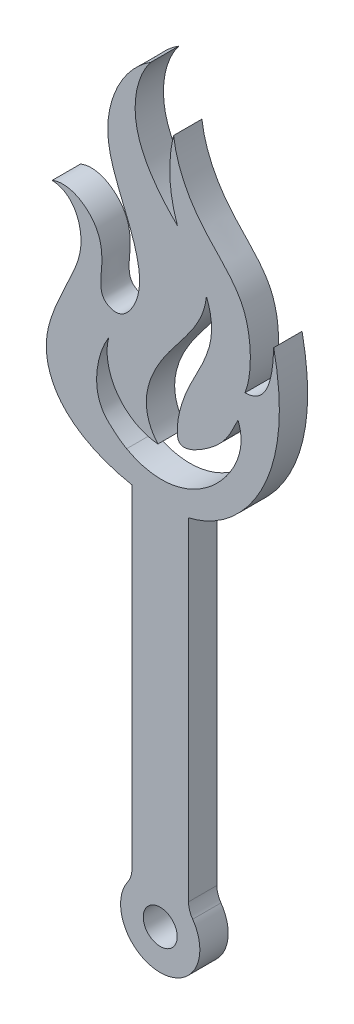
ISO-10303-21;
HEADER;
FILE_DESCRIPTION(('STEP AP214'),'2;1');
FILE_NAME('part.step','',(''),(''),'','','');
FILE_SCHEMA(('AUTOMOTIVE_DESIGN { 1 0 10303 214 1 1 1 1 }'));
ENDSEC;
DATA;
#1=APPLICATION_CONTEXT('core data for automotive mechanical design processes');
#2=APPLICATION_PROTOCOL_DEFINITION('international standard','automotive_design',2000,#1);
#3=PRODUCT_CONTEXT('',#1,'mechanical');
#4=PRODUCT('Part','Part','',(#3));
#5=PRODUCT_RELATED_PRODUCT_CATEGORY('part','',(#4));
#6=PRODUCT_DEFINITION_FORMATION('','',#4);
#7=PRODUCT_DEFINITION_CONTEXT('part definition',#1,'design');
#8=PRODUCT_DEFINITION('design','',#6,#7);
#9=PRODUCT_DEFINITION_SHAPE('','',#8);
#10=(LENGTH_UNIT() NAMED_UNIT(*) SI_UNIT(.MILLI.,.METRE.));
#11=(NAMED_UNIT(*) PLANE_ANGLE_UNIT() SI_UNIT($,.RADIAN.));
#12=(NAMED_UNIT(*) SI_UNIT($,.STERADIAN.) SOLID_ANGLE_UNIT());
#13=UNCERTAINTY_MEASURE_WITH_UNIT(LENGTH_MEASURE(1.E-05),#10,'distance_accuracy_value','');
#14=(GEOMETRIC_REPRESENTATION_CONTEXT(3) GLOBAL_UNCERTAINTY_ASSIGNED_CONTEXT((#13)) GLOBAL_UNIT_ASSIGNED_CONTEXT((#10,
#11,#12)) REPRESENTATION_CONTEXT('',''));
#15=CARTESIAN_POINT('',(0.,0.,0.));
#16=DIRECTION('',(0.,0.,1.));
#17=DIRECTION('',(1.,0.,0.));
#18=AXIS2_PLACEMENT_3D('',#15,#16,#17);
#19=CARTESIAN_POINT('',(-4.5,3.16227766016838,2.5));
#20=DIRECTION('',(0.,0.,-1.));
#21=DIRECTION('',(-1.,0.,0.));
#22=AXIS2_PLACEMENT_3D('',#19,#20,#21);
#23=PLANE('',#22);
#24=DIRECTION('',(0.,1.,0.));
#25=VECTOR('',#24,1.);
#26=CARTESIAN_POINT('',(2.5,3.16227766016838,2.5));
#27=LINE('',#26,#25);
#28=CARTESIAN_POINT('',(2.5,3.16227766016838,2.5));
#29=VERTEX_POINT('',#28);
#30=CARTESIAN_POINT('',(2.49999999029242,32.5197236566721,2.5));
#31=VERTEX_POINT('',#30);
#32=EDGE_CURVE('E404',#29,#31,#27,.T.);
#33=ORIENTED_EDGE('',*,*,#32,.T.);
#34=CARTESIAN_POINT('',(10.0215195762299,49.2926233796134,2.5));
#35=CARTESIAN_POINT('',(10.5629229150883,46.6911220435722,2.5));
#36=CARTESIAN_POINT('',(10.8473599430749,41.9965481647444,2.5));
#37=CARTESIAN_POINT('',(8.01912510882976,35.3828982693129,2.5));
#38=CARTESIAN_POINT('',(4.24658066054622,32.7190283289578,2.5));
#39=CARTESIAN_POINT('',(1.69954817010965,32.3698649960101,2.5));
#40=B_SPLINE_CURVE_WITH_KNOTS('',3,(#34,#35,#36,#37,#38,#39),.UNSPECIFIED.,.F.,.F.,(4,1,1,4),
(0.,0.383344552097258,0.656086203099955,1.),.UNSPECIFIED.);
#41=CARTESIAN_POINT('',(10.0215195762299,49.2926233796134,2.5));
#42=VERTEX_POINT('',#41);
#43=EDGE_CURVE('E237',#31,#42,#40,.F.);
#44=ORIENTED_EDGE('',*,*,#43,.T.);
#45=CARTESIAN_POINT('',(7.48535231010146,44.5693598019665,2.5));
#46=CARTESIAN_POINT('',(9.81467097454117,44.5706924915672,2.5));
#47=CARTESIAN_POINT('',(9.95438839272268,47.7175172464842,2.5));
#48=CARTESIAN_POINT('',(10.0215195762299,49.2926233796134,2.5));
#49=B_SPLINE_CURVE_WITH_KNOTS('',3,(#45,#46,#47,#48),.UNSPECIFIED.,.F.,.F.,(4,4),(0.,1.),.UNSPECIFIED.);
#50=CARTESIAN_POINT('',(7.48535231010146,44.5693598019665,2.5));
#51=VERTEX_POINT('',#50);
#52=EDGE_CURVE('E244',#42,#51,#49,.F.);
#53=ORIENTED_EDGE('',*,*,#52,.T.);
#54=CARTESIAN_POINT('',(1.17819794851139,61.0895272607658,2.5));
#55=CARTESIAN_POINT('',(1.45472809990184,58.9635735649893,2.5));
#56=CARTESIAN_POINT('',(3.22122630729269,55.3695109460361,2.5));
#57=CARTESIAN_POINT('',(7.32555201717921,52.1053239640368,2.5));
#58=CARTESIAN_POINT('',(8.09982119042889,47.9498492754425,2.5));
#59=CARTESIAN_POINT('',(7.90988611510032,45.7039675829994,2.5));
#60=CARTESIAN_POINT('',(7.48535231010146,44.5693598019665,2.5));
#61=B_SPLINE_CURVE_WITH_KNOTS('',3,(#54,#55,#56,#57,#58,#59,#60),.UNSPECIFIED.,.F.,.F.,(4,1,1,1,
4),(0.,0.342132631321707,0.634924534312461,0.806626116951082,1.),.UNSPECIFIED.);
#62=CARTESIAN_POINT('',(1.17819794851139,61.0895272607658,2.5));
#63=VERTEX_POINT('',#62);
#64=EDGE_CURVE('E251',#51,#63,#61,.F.);
#65=ORIENTED_EDGE('',*,*,#64,.T.);
#66=CARTESIAN_POINT('',(1.51803895142469,54.3682274253695,2.5));
#67=CARTESIAN_POINT('',(0.358733967556181,57.6638184742051,2.5));
#68=CARTESIAN_POINT('',(1.17819794851139,61.0895272607658,2.5));
#69=B_SPLINE_CURVE_WITH_KNOTS('',2,(#66,#67,#68),.UNSPECIFIED.,.F.,.F.,(3,3),(0.,1.),.UNSPECIFIED.);
#70=CARTESIAN_POINT('',(1.51803895142469,54.3682274253695,2.5));
#71=VERTEX_POINT('',#70);
#72=EDGE_CURVE('E169',#63,#71,#69,.F.);
#73=ORIENTED_EDGE('',*,*,#72,.T.);
#74=CARTESIAN_POINT('',(-0.84843786783928,65.6664024991157,2.5));
#75=CARTESIAN_POINT('',(-2.02317967683376,64.1411728484055,2.5));
#76=CARTESIAN_POINT('',(-2.96697399308505,59.5700463493118,2.5));
#77=CARTESIAN_POINT('',(-0.0770793192063524,55.9204845792185,2.5));
#78=CARTESIAN_POINT('',(1.51803895142469,54.3682274253695,2.5));
#79=B_SPLINE_CURVE_WITH_KNOTS('',3,(#74,#75,#76,#77,#78),.UNSPECIFIED.,.F.,.F.,(4,1,4),(0.,
0.453669463377864,1.),.UNSPECIFIED.);
#80=CARTESIAN_POINT('',(-0.848437867839281,65.6664024991157,2.5));
#81=VERTEX_POINT('',#80);
#82=EDGE_CURVE('E162',#71,#81,#79,.F.);
#83=ORIENTED_EDGE('',*,*,#82,.T.);
#84=CARTESIAN_POINT('',(-9.53875204984992,52.298610494071,2.5));
#85=CARTESIAN_POINT('',(-8.04052770344554,52.9261824028341,2.5));
#86=CARTESIAN_POINT('',(-5.2697163059094,51.2361215508105,2.5));
#87=CARTESIAN_POINT('',(-5.04798894026985,48.0047629407501,2.5));
#88=CARTESIAN_POINT('',(-5.46270776541179,45.5559737434582,2.5));
#89=CARTESIAN_POINT('',(-3.35046463037467,44.6291791015522,2.5));
#90=CARTESIAN_POINT('',(-1.68181670195504,47.050669752705,2.5));
#91=CARTESIAN_POINT('',(-1.84353321740374,50.0938386186137,2.5));
#92=CARTESIAN_POINT('',(-3.26797622962634,53.7324604391754,2.5));
#93=CARTESIAN_POINT('',(-5.69385291631256,59.1885390553043,2.5));
#94=CARTESIAN_POINT('',(-3.32206415126602,64.1139489017382,2.5));
#95=CARTESIAN_POINT('',(-0.848437867839281,65.6664024991157,2.5));
#96=B_SPLINE_CURVE_WITH_KNOTS('',3,(#84,#85,#86,#87,#88,#89,#90,#91,#92,#93,#94,#95),
.UNSPECIFIED.,.F.,.F.,(4,1,1,1,1,1,1,1,1,4),(0.,0.135073549734254,0.221026782922645,
0.289623494858139,0.317982017098499,0.397027048099674,0.482985461534156,0.59340084116514,
0.740558490982547,1.),.UNSPECIFIED.);
#97=CARTESIAN_POINT('',(-9.53875204984992,52.298610494071,2.5));
#98=VERTEX_POINT('',#97);
#99=EDGE_CURVE('E166',#81,#98,#96,.F.);
#100=ORIENTED_EDGE('',*,*,#99,.T.);
#101=CARTESIAN_POINT('',(1.69954817010965,32.3698649960101,2.5));
#102=CARTESIAN_POINT('',(-1.38510022070083,31.9470018730813,2.5));
#103=CARTESIAN_POINT('',(-8.13083125844239,33.1855813369842,2.5));
#104=CARTESIAN_POINT('',(-10.8595028806167,40.267632338942,2.5));
#105=CARTESIAN_POINT('',(-8.33708908836483,44.467605106114,2.5));
#106=CARTESIAN_POINT('',(-6.47024998615528,49.1927241618382,2.5));
#107=CARTESIAN_POINT('',(-7.65281796537407,52.2078348362363,2.5));
#108=CARTESIAN_POINT('',(-9.53875204984992,52.298610494071,2.5));
#109=B_SPLINE_CURVE_WITH_KNOTS('',3,(#101,#102,#103,#104,#105,#106,#107,#108),.UNSPECIFIED.,.F.,
.F.,(4,1,1,1,1,4),(0.,0.389446078020164,0.476704242707087,0.741561352853454,0.833903947137661,
1.),.UNSPECIFIED.);
#110=CARTESIAN_POINT('',(-2.5,32.542144580587,2.5));
#111=VERTEX_POINT('',#110);
#112=EDGE_CURVE('E51',#98,#111,#109,.F.);
#113=ORIENTED_EDGE('',*,*,#112,.T.);
#114=DIRECTION('',(0.,-1.,0.));
#115=VECTOR('',#114,1.);
#116=CARTESIAN_POINT('',(-2.5,3.16227766016838,2.5));
#117=LINE('',#116,#115);
#118=CARTESIAN_POINT('',(-2.5,3.16227766016838,2.5));
#119=VERTEX_POINT('',#118);
#120=EDGE_CURVE('E57',#111,#119,#117,.T.);
#121=ORIENTED_EDGE('',*,*,#120,.T.);
#122=CARTESIAN_POINT('',(-4.5,3.16227766016838,2.5));
#123=DIRECTION('',(0.,0.,-1.));
#124=DIRECTION('',(-1.,0.,0.));
#125=AXIS2_PLACEMENT_3D('',#122,#123,#124);
#126=CIRCLE('',#125,2.);
#127=CARTESIAN_POINT('',(-2.86363636363636,2.01235851101624,2.5));
#128=VERTEX_POINT('',#127);
#129=EDGE_CURVE('E399',#119,#128,#126,.T.);
#130=ORIENTED_EDGE('',*,*,#129,.T.);
#131=CARTESIAN_POINT('',(0.,0.,2.5));
#132=DIRECTION('',(0.,0.,1.));
#133=DIRECTION('',(1.,0.,0.));
#134=AXIS2_PLACEMENT_3D('',#131,#132,#133);
#135=CIRCLE('',#134,3.5);
#136=CARTESIAN_POINT('',(2.86363636363636,2.01235851101624,2.5));
#137=VERTEX_POINT('',#136);
#138=EDGE_CURVE('E87',#128,#137,#135,.T.);
#139=ORIENTED_EDGE('',*,*,#138,.T.);
#140=CARTESIAN_POINT('',(4.5,3.16227766016838,2.5));
#141=DIRECTION('',(0.,0.,-1.));
#142=DIRECTION('',(1.,0.,0.));
#143=AXIS2_PLACEMENT_3D('',#140,#141,#142);
#144=CIRCLE('',#143,2.);
#145=EDGE_CURVE('E402',#137,#29,#144,.T.);
#146=ORIENTED_EDGE('',*,*,#145,.T.);
#147=EDGE_LOOP('',(#33,#44,#53,#65,#73,#83,#100,#113,#121,#130,#139,#146));
#148=FACE_BOUND('',#147,.T.);
#149=CARTESIAN_POINT('',(0.,0.,2.5));
#150=DIRECTION('',(0.,0.,1.));
#151=DIRECTION('',(1.,0.,0.));
#152=AXIS2_PLACEMENT_3D('',#149,#150,#151);
#153=CIRCLE('',#152,1.5);
#154=CARTESIAN_POINT('',(1.5,0.,2.5));
#155=VERTEX_POINT('',#154);
#156=EDGE_CURVE('E389',#155,#155,#153,.T.);
#157=ORIENTED_EDGE('',*,*,#156,.F.);
#158=EDGE_LOOP('',(#157));
#159=FACE_BOUND('',#158,.T.);
#160=CARTESIAN_POINT('',(-4.54479331219581,42.7863140567871,2.5));
#161=CARTESIAN_POINT('',(-5.52706483025426,41.2258828070278,2.5));
#162=CARTESIAN_POINT('',(-6.2847968956525,37.9469358207537,2.5));
#163=CARTESIAN_POINT('',(-4.10586609067444,35.8550391302871,2.5));
#164=CARTESIAN_POINT('',(-3.49001859244435,35.3688688540497,2.5));
#165=CARTESIAN_POINT('',(-2.96222266682487,35.0702194264165,2.5));
#166=B_SPLINE_CURVE_WITH_KNOTS('',3,(#160,#161,#162,#163,#164,#165),.UNSPECIFIED.,.F.,.F.,(4,1,
1,4),(0.,0.715192832798007,0.811866200375649,1.),.UNSPECIFIED.);
#167=CARTESIAN_POINT('',(-2.96222266682487,35.0702194264165,2.5));
#168=VERTEX_POINT('',#167);
#169=CARTESIAN_POINT('',(-4.54479331219581,42.7863140567871,2.5));
#170=VERTEX_POINT('',#169);
#171=EDGE_CURVE('E204',#168,#170,#166,.F.);
#172=ORIENTED_EDGE('',*,*,#171,.T.);
#173=CARTESIAN_POINT('',(-0.206092880963217,36.8078700353469,2.5));
#174=CARTESIAN_POINT('',(-1.57531723463738,36.9208013978478,2.5));
#175=CARTESIAN_POINT('',(-4.22115995074175,38.3936789698244,2.5));
#176=CARTESIAN_POINT('',(-4.9137726520299,41.4290185891535,2.5));
#177=CARTESIAN_POINT('',(-4.54479331219581,42.7863140567871,2.5));
#178=B_SPLINE_CURVE_WITH_KNOTS('',3,(#173,#174,#175,#176,#177),.UNSPECIFIED.,.F.,.F.,(4,1,4),
(0.,0.493076315698918,1.),.UNSPECIFIED.);
#179=CARTESIAN_POINT('',(-0.206092880963216,36.8078700353469,2.5));
#180=VERTEX_POINT('',#179);
#181=EDGE_CURVE('E208',#170,#180,#178,.F.);
#182=ORIENTED_EDGE('',*,*,#181,.T.);
#183=CARTESIAN_POINT('',(4.07780876704902,50.2389635839819,2.5));
#184=CARTESIAN_POINT('',(3.91712509888466,48.4877926946889,2.5));
#185=CARTESIAN_POINT('',(2.13920740466798,46.0583705734289,2.5));
#186=CARTESIAN_POINT('',(-0.97660045482756,42.1953037594595,2.5));
#187=CARTESIAN_POINT('',(-1.79993940419789,38.6647440271417,2.5));
#188=CARTESIAN_POINT('',(-0.206092880963216,36.8078700353469,2.5));
#189=B_SPLINE_CURVE_WITH_KNOTS('',3,(#183,#184,#185,#186,#187,#188),.UNSPECIFIED.,.F.,.F.,(4,1,
1,4),(0.,0.339221598575795,0.587956721842541,1.),.UNSPECIFIED.);
#190=CARTESIAN_POINT('',(4.07780876704902,50.2389635839819,2.5));
#191=VERTEX_POINT('',#190);
#192=EDGE_CURVE('E216',#180,#191,#189,.F.);
#193=ORIENTED_EDGE('',*,*,#192,.T.);
#194=CARTESIAN_POINT('',(6.87143817486748,42.1715598041971,2.5));
#195=CARTESIAN_POINT('',(6.18353345510758,40.7579220717398,2.5));
#196=CARTESIAN_POINT('',(5.5424043013129,39.3058364062192,2.5));
#197=CARTESIAN_POINT('',(1.50454233587261,36.9924209692552,2.5));
#198=CARTESIAN_POINT('',(1.48654704277532,39.1233536633485,2.5));
#199=CARTESIAN_POINT('',(1.70686140254498,40.376400275999,2.5));
#200=CARTESIAN_POINT('',(2.31707226364244,42.2155348077904,2.5));
#201=CARTESIAN_POINT('',(3.50838250997943,44.4006414033112,2.5));
#202=CARTESIAN_POINT('',(4.77852352908864,47.1548787886821,2.5));
#203=CARTESIAN_POINT('',(4.46675167030846,49.3077066119245,2.5));
#204=CARTESIAN_POINT('',(4.07780876704902,50.2389635839819,2.5));
#205=B_SPLINE_CURVE_WITH_KNOTS('',3,(#194,#195,#196,#197,#198,#199,#200,#201,#202,#203,#204),
.UNSPECIFIED.,.F.,.F.,(4,1,1,1,1,1,1,1,4),(0.,0.205207900835999,0.355343407743051,
0.404867241482767,0.471006587831741,0.557598082543656,0.68913555051967,0.848468013059469,1.),.UNSPECIFIED.);
#206=CARTESIAN_POINT('',(6.87143817486748,42.1715598041971,2.5));
#207=VERTEX_POINT('',#206);
#208=EDGE_CURVE('E223',#191,#207,#205,.F.);
#209=ORIENTED_EDGE('',*,*,#208,.T.);
#210=CARTESIAN_POINT('',(-2.96222266682487,35.0702194264165,2.5));
#211=CARTESIAN_POINT('',(-1.83609069509431,34.4330059647892,2.5));
#212=CARTESIAN_POINT('',(1.64774093605716,33.6809038654547,2.5));
#213=CARTESIAN_POINT('',(6.28804187054051,36.8512118425579,2.5));
#214=CARTESIAN_POINT('',(7.48151092230521,40.6622833816706,2.5));
#215=CARTESIAN_POINT('',(6.87143817486748,42.1715598041971,2.5));
#216=B_SPLINE_CURVE_WITH_KNOTS('',3,(#210,#211,#212,#213,#214,#215),.UNSPECIFIED.,.F.,.F.,(4,1,
1,4),(0.,0.254823983674718,0.682331242602282,1.),.UNSPECIFIED.);
#217=EDGE_CURVE('E230',#207,#168,#216,.F.);
#218=ORIENTED_EDGE('',*,*,#217,.T.);
#219=EDGE_LOOP('',(#172,#182,#193,#209,#218));
#220=FACE_BOUND('',#219,.T.);
#221=ADVANCED_FACE('F36',(#148,#159,#220),#23,.F.);
#222=CARTESIAN_POINT('',(-4.5,3.16227766016838,0.));
#223=DIRECTION('',(0.,0.,-1.));
#224=DIRECTION('',(-1.,0.,0.));
#225=AXIS2_PLACEMENT_3D('',#222,#223,#224);
#226=PLANE('',#225);
#227=CARTESIAN_POINT('',(10.0215195762299,49.2926233796134,0.));
#228=CARTESIAN_POINT('',(10.5629229150883,46.6911220435722,0.));
#229=CARTESIAN_POINT('',(10.8473599430749,41.9965481647444,0.));
#230=CARTESIAN_POINT('',(8.01912510882976,35.3828982693129,0.));
#231=CARTESIAN_POINT('',(4.24658066054622,32.7190283289578,0.));
#232=CARTESIAN_POINT('',(1.69954817010965,32.3698649960101,0.));
#233=B_SPLINE_CURVE_WITH_KNOTS('',3,(#227,#228,#229,#230,#231,#232),.UNSPECIFIED.,.F.,.F.,(4,1,
1,4),(0.,0.383344552097258,0.656086203099955,1.),.UNSPECIFIED.);
#234=CARTESIAN_POINT('',(10.0215195762299,49.2926233796134,0.));
#235=VERTEX_POINT('',#234);
#236=CARTESIAN_POINT('',(2.49999999029242,32.5197236566721,0.));
#237=VERTEX_POINT('',#236);
#238=EDGE_CURVE('E455',#235,#237,#233,.T.);
#239=ORIENTED_EDGE('',*,*,#238,.T.);
#240=DIRECTION('',(0.,1.,0.));
#241=VECTOR('',#240,1.);
#242=CARTESIAN_POINT('',(2.5,3.16227766016838,0.));
#243=LINE('',#242,#241);
#244=CARTESIAN_POINT('',(2.5,3.16227766016838,0.));
#245=VERTEX_POINT('',#244);
#246=EDGE_CURVE('E414',#245,#237,#243,.T.);
#247=ORIENTED_EDGE('',*,*,#246,.F.);
#248=CARTESIAN_POINT('',(4.5,3.16227766016838,0.));
#249=DIRECTION('',(0.,0.,-1.));
#250=DIRECTION('',(1.,0.,0.));
#251=AXIS2_PLACEMENT_3D('',#248,#249,#250);
#252=CIRCLE('',#251,2.);
#253=CARTESIAN_POINT('',(2.86363636363636,2.01235851101624,0.));
#254=VERTEX_POINT('',#253);
#255=EDGE_CURVE('E412',#254,#245,#252,.T.);
#256=ORIENTED_EDGE('',*,*,#255,.F.);
#257=CARTESIAN_POINT('',(0.,0.,0.));
#258=DIRECTION('',(0.,0.,1.));
#259=DIRECTION('',(1.,0.,0.));
#260=AXIS2_PLACEMENT_3D('',#257,#258,#259);
#261=CIRCLE('',#260,3.5);
#262=CARTESIAN_POINT('',(-2.86363636363636,2.01235851101624,0.));
#263=VERTEX_POINT('',#262);
#264=EDGE_CURVE('E410',#263,#254,#261,.T.);
#265=ORIENTED_EDGE('',*,*,#264,.F.);
#266=CARTESIAN_POINT('',(-4.5,3.16227766016838,0.));
#267=DIRECTION('',(0.,0.,-1.));
#268=DIRECTION('',(-1.,0.,0.));
#269=AXIS2_PLACEMENT_3D('',#266,#267,#268);
#270=CIRCLE('',#269,2.);
#271=CARTESIAN_POINT('',(-2.5,3.16227766016838,0.));
#272=VERTEX_POINT('',#271);
#273=EDGE_CURVE('E395',#272,#263,#270,.T.);
#274=ORIENTED_EDGE('',*,*,#273,.F.);
#275=DIRECTION('',(0.,-1.,0.));
#276=VECTOR('',#275,1.);
#277=CARTESIAN_POINT('',(-2.5,3.16227766016838,0.));
#278=LINE('',#277,#276);
#279=CARTESIAN_POINT('',(-2.49999999314119,32.542144580587,0.));
#280=VERTEX_POINT('',#279);
#281=EDGE_CURVE('E79',#280,#272,#278,.T.);
#282=ORIENTED_EDGE('',*,*,#281,.F.);
#283=CARTESIAN_POINT('',(1.69954817010965,32.3698649960101,0.));
#284=CARTESIAN_POINT('',(-1.38510022070083,31.9470018730813,0.));
#285=CARTESIAN_POINT('',(-8.13083125844239,33.1855813369842,0.));
#286=CARTESIAN_POINT('',(-10.8595028806167,40.267632338942,0.));
#287=CARTESIAN_POINT('',(-8.33708908836483,44.467605106114,0.));
#288=CARTESIAN_POINT('',(-6.47024998615528,49.1927241618382,0.));
#289=CARTESIAN_POINT('',(-7.65281796537407,52.2078348362363,0.));
#290=CARTESIAN_POINT('',(-9.53875204984992,52.298610494071,0.));
#291=B_SPLINE_CURVE_WITH_KNOTS('',3,(#283,#284,#285,#286,#287,#288,#289,#290),.UNSPECIFIED.,.F.,
.F.,(4,1,1,1,1,4),(0.,0.389446078020164,0.476704242707087,0.741561352853454,0.833903947137661,
1.),.UNSPECIFIED.);
#292=CARTESIAN_POINT('',(-9.53875204984992,52.298610494071,0.));
#293=VERTEX_POINT('',#292);
#294=EDGE_CURVE('E432',#280,#293,#291,.T.);
#295=ORIENTED_EDGE('',*,*,#294,.T.);
#296=CARTESIAN_POINT('',(-9.53875204984992,52.298610494071,0.));
#297=CARTESIAN_POINT('',(-8.04052770344554,52.9261824028341,0.));
#298=CARTESIAN_POINT('',(-5.2697163059094,51.2361215508105,0.));
#299=CARTESIAN_POINT('',(-5.04798894026985,48.0047629407501,0.));
#300=CARTESIAN_POINT('',(-5.46270776541179,45.5559737434582,0.));
#301=CARTESIAN_POINT('',(-3.35046463037467,44.6291791015522,0.));
#302=CARTESIAN_POINT('',(-1.68181670195504,47.050669752705,0.));
#303=CARTESIAN_POINT('',(-1.84353321740374,50.0938386186137,0.));
#304=CARTESIAN_POINT('',(-3.26797622962634,53.7324604391754,0.));
#305=CARTESIAN_POINT('',(-5.69385291631256,59.1885390553043,0.));
#306=CARTESIAN_POINT('',(-3.32206415126602,64.1139489017382,0.));
#307=CARTESIAN_POINT('',(-0.848437867839281,65.6664024991157,0.));
#308=B_SPLINE_CURVE_WITH_KNOTS('',3,(#296,#297,#298,#299,#300,#301,#302,#303,#304,#305,#306,
#307),.UNSPECIFIED.,.F.,.F.,(4,1,1,1,1,1,1,1,1,4),(0.,0.135073549734254,0.221026782922645,
0.289623494858139,0.317982017098499,0.397027048099674,0.482985461534156,0.59340084116514,
0.740558490982547,1.),.UNSPECIFIED.);
#309=CARTESIAN_POINT('',(-0.848437867839281,65.6664024991157,0.));
#310=VERTEX_POINT('',#309);
#311=EDGE_CURVE('E472',#293,#310,#308,.T.);
#312=ORIENTED_EDGE('',*,*,#311,.T.);
#313=CARTESIAN_POINT('',(-0.84843786783928,65.6664024991157,0.));
#314=CARTESIAN_POINT('',(-2.02317967683376,64.1411728484055,0.));
#315=CARTESIAN_POINT('',(-2.96697399308505,59.5700463493118,0.));
#316=CARTESIAN_POINT('',(-0.0770793192063524,55.9204845792185,0.));
#317=CARTESIAN_POINT('',(1.51803895142469,54.3682274253695,0.));
#318=B_SPLINE_CURVE_WITH_KNOTS('',3,(#313,#314,#315,#316,#317),.UNSPECIFIED.,.F.,.F.,(4,1,4),
(0.,0.453669463377864,1.),.UNSPECIFIED.);
#319=CARTESIAN_POINT('',(1.51803895142469,54.3682274253695,0.));
#320=VERTEX_POINT('',#319);
#321=EDGE_CURVE('E184',#310,#320,#318,.T.);
#322=ORIENTED_EDGE('',*,*,#321,.T.);
#323=CARTESIAN_POINT('',(1.51803895142469,54.3682274253695,0.));
#324=CARTESIAN_POINT('',(0.358733967556181,57.6638184742051,0.));
#325=CARTESIAN_POINT('',(1.17819794851139,61.0895272607658,0.));
#326=B_SPLINE_CURVE_WITH_KNOTS('',2,(#323,#324,#325),.UNSPECIFIED.,.F.,.F.,(3,3),(0.,1.),.UNSPECIFIED.);
#327=CARTESIAN_POINT('',(1.17819794851139,61.0895272607658,0.));
#328=VERTEX_POINT('',#327);
#329=EDGE_CURVE('E467',#320,#328,#326,.T.);
#330=ORIENTED_EDGE('',*,*,#329,.T.);
#331=CARTESIAN_POINT('',(1.17819794851139,61.0895272607658,0.));
#332=CARTESIAN_POINT('',(1.45472809990184,58.9635735649893,0.));
#333=CARTESIAN_POINT('',(3.22122630729269,55.3695109460361,0.));
#334=CARTESIAN_POINT('',(7.32555201717921,52.1053239640368,0.));
#335=CARTESIAN_POINT('',(8.09982119042889,47.9498492754425,0.));
#336=CARTESIAN_POINT('',(7.90988611510032,45.7039675829994,0.));
#337=CARTESIAN_POINT('',(7.48535231010146,44.5693598019665,0.));
#338=B_SPLINE_CURVE_WITH_KNOTS('',3,(#331,#332,#333,#334,#335,#336,#337),.UNSPECIFIED.,.F.,.F.,
(4,1,1,1,4),(0.,0.342132631321707,0.634924534312461,0.806626116951082,1.),.UNSPECIFIED.);
#339=CARTESIAN_POINT('',(7.48535231010146,44.5693598019665,0.));
#340=VERTEX_POINT('',#339);
#341=EDGE_CURVE('E469',#328,#340,#338,.T.);
#342=ORIENTED_EDGE('',*,*,#341,.T.);
#343=CARTESIAN_POINT('',(7.48535231010146,44.5693598019665,0.));
#344=CARTESIAN_POINT('',(9.81467097454117,44.5706924915672,0.));
#345=CARTESIAN_POINT('',(9.95438839272268,47.7175172464842,0.));
#346=CARTESIAN_POINT('',(10.0215195762299,49.2926233796134,0.));
#347=B_SPLINE_CURVE_WITH_KNOTS('',3,(#343,#344,#345,#346),.UNSPECIFIED.,.F.,.F.,(4,4),(0.,1.),.UNSPECIFIED.);
#348=EDGE_CURVE('E209',#340,#235,#347,.T.);
#349=ORIENTED_EDGE('',*,*,#348,.T.);
#350=EDGE_LOOP('',(#239,#247,#256,#265,#274,#282,#295,#312,#322,#330,#342,#349));
#351=FACE_BOUND('',#350,.T.);
#352=CARTESIAN_POINT('',(0.,0.,0.));
#353=DIRECTION('',(0.,0.,1.));
#354=DIRECTION('',(1.,0.,0.));
#355=AXIS2_PLACEMENT_3D('',#352,#353,#354);
#356=CIRCLE('',#355,1.5);
#357=CARTESIAN_POINT('',(1.5,0.,0.));
#358=VERTEX_POINT('',#357);
#359=EDGE_CURVE('E396',#358,#358,#356,.T.);
#360=ORIENTED_EDGE('',*,*,#359,.T.);
#361=EDGE_LOOP('',(#360));
#362=FACE_BOUND('',#361,.T.);
#363=CARTESIAN_POINT('',(-4.54479331219581,42.7863140567871,0.));
#364=CARTESIAN_POINT('',(-5.52706483025426,41.2258828070278,0.));
#365=CARTESIAN_POINT('',(-6.2847968956525,37.9469358207537,0.));
#366=CARTESIAN_POINT('',(-4.10586609067444,35.8550391302871,0.));
#367=CARTESIAN_POINT('',(-3.49001859244435,35.3688688540497,0.));
#368=CARTESIAN_POINT('',(-2.96222266682487,35.0702194264165,0.));
#369=B_SPLINE_CURVE_WITH_KNOTS('',3,(#363,#364,#365,#366,#367,#368),.UNSPECIFIED.,.F.,.F.,(4,1,
1,4),(0.,0.715192832798007,0.811866200375649,1.),.UNSPECIFIED.);
#370=CARTESIAN_POINT('',(-4.54479331219581,42.7863140567871,0.));
#371=VERTEX_POINT('',#370);
#372=CARTESIAN_POINT('',(-2.96222266682487,35.0702194264165,0.));
#373=VERTEX_POINT('',#372);
#374=EDGE_CURVE('E196',#371,#373,#369,.T.);
#375=ORIENTED_EDGE('',*,*,#374,.T.);
#376=CARTESIAN_POINT('',(-2.96222266682487,35.0702194264165,0.));
#377=CARTESIAN_POINT('',(-1.83609069509431,34.4330059647892,0.));
#378=CARTESIAN_POINT('',(1.64774093605716,33.6809038654547,0.));
#379=CARTESIAN_POINT('',(6.28804187054051,36.8512118425579,0.));
#380=CARTESIAN_POINT('',(7.48151092230521,40.6622833816706,0.));
#381=CARTESIAN_POINT('',(6.87143817486748,42.1715598041971,0.));
#382=B_SPLINE_CURVE_WITH_KNOTS('',3,(#376,#377,#378,#379,#380,#381),.UNSPECIFIED.,.F.,.F.,(4,1,
1,4),(0.,0.254823983674718,0.682331242602282,1.),.UNSPECIFIED.);
#383=CARTESIAN_POINT('',(6.87143817486748,42.1715598041971,0.));
#384=VERTEX_POINT('',#383);
#385=EDGE_CURVE('E498',#373,#384,#382,.T.);
#386=ORIENTED_EDGE('',*,*,#385,.T.);
#387=CARTESIAN_POINT('',(6.87143817486748,42.1715598041971,0.));
#388=CARTESIAN_POINT('',(6.18353345510758,40.7579220717398,0.));
#389=CARTESIAN_POINT('',(5.5424043013129,39.3058364062192,0.));
#390=CARTESIAN_POINT('',(1.50454233587261,36.9924209692552,0.));
#391=CARTESIAN_POINT('',(1.48654704277532,39.1233536633485,0.));
#392=CARTESIAN_POINT('',(1.70686140254498,40.376400275999,0.));
#393=CARTESIAN_POINT('',(2.31707226364244,42.2155348077904,0.));
#394=CARTESIAN_POINT('',(3.50838250997943,44.4006414033112,0.));
#395=CARTESIAN_POINT('',(4.77852352908864,47.1548787886821,0.));
#396=CARTESIAN_POINT('',(4.46675167030846,49.3077066119245,0.));
#397=CARTESIAN_POINT('',(4.07780876704902,50.2389635839819,0.));
#398=B_SPLINE_CURVE_WITH_KNOTS('',3,(#387,#388,#389,#390,#391,#392,#393,#394,#395,#396,#397),
.UNSPECIFIED.,.F.,.F.,(4,1,1,1,1,1,1,1,4),(0.,0.205207900835999,0.355343407743051,
0.404867241482767,0.471006587831741,0.557598082543656,0.68913555051967,0.848468013059469,1.),.UNSPECIFIED.);
#399=CARTESIAN_POINT('',(4.07780876704902,50.2389635839819,0.));
#400=VERTEX_POINT('',#399);
#401=EDGE_CURVE('E506',#384,#400,#398,.T.);
#402=ORIENTED_EDGE('',*,*,#401,.T.);
#403=CARTESIAN_POINT('',(4.07780876704902,50.2389635839819,0.));
#404=CARTESIAN_POINT('',(3.91712509888466,48.4877926946889,0.));
#405=CARTESIAN_POINT('',(2.13920740466798,46.0583705734289,0.));
#406=CARTESIAN_POINT('',(-0.97660045482756,42.1953037594595,0.));
#407=CARTESIAN_POINT('',(-1.79993940419789,38.6647440271417,0.));
#408=CARTESIAN_POINT('',(-0.206092880963216,36.8078700353469,0.));
#409=B_SPLINE_CURVE_WITH_KNOTS('',3,(#403,#404,#405,#406,#407,#408),.UNSPECIFIED.,.F.,.F.,(4,1,
1,4),(0.,0.339221598575795,0.587956721842541,1.),.UNSPECIFIED.);
#410=CARTESIAN_POINT('',(-0.206092880963216,36.8078700353469,0.));
#411=VERTEX_POINT('',#410);
#412=EDGE_CURVE('E514',#400,#411,#409,.T.);
#413=ORIENTED_EDGE('',*,*,#412,.T.);
#414=CARTESIAN_POINT('',(-0.206092880963217,36.8078700353469,0.));
#415=CARTESIAN_POINT('',(-1.57531723463738,36.9208013978478,0.));
#416=CARTESIAN_POINT('',(-4.22115995074175,38.3936789698244,0.));
#417=CARTESIAN_POINT('',(-4.9137726520299,41.4290185891535,0.));
#418=CARTESIAN_POINT('',(-4.54479331219581,42.7863140567871,0.));
#419=B_SPLINE_CURVE_WITH_KNOTS('',3,(#414,#415,#416,#417,#418),.UNSPECIFIED.,.F.,.F.,(4,1,4),
(0.,0.493076315698918,1.),.UNSPECIFIED.);
#420=EDGE_CURVE('E497',#411,#371,#419,.T.);
#421=ORIENTED_EDGE('',*,*,#420,.T.);
#422=EDGE_LOOP('',(#375,#386,#402,#413,#421));
#423=FACE_BOUND('',#422,.T.);
#424=ADVANCED_FACE('F430',(#351,#362,#423),#226,.T.);
#425=CARTESIAN_POINT('',(-4.5,3.16227766016838,2.5));
#426=DIRECTION('',(0.,0.,-1.));
#427=DIRECTION('',(-1.,0.,0.));
#428=AXIS2_PLACEMENT_3D('',#425,#426,#427);
#429=CYLINDRICAL_SURFACE('',#428,2.);
#430=ORIENTED_EDGE('',*,*,#273,.T.);
#431=DIRECTION('',(0.,0.,-1.));
#432=VECTOR('',#431,1.);
#433=CARTESIAN_POINT('',(-2.86363636363636,2.01235851101624,2.5));
#434=LINE('',#433,#432);
#435=EDGE_CURVE('E425',#128,#263,#434,.T.);
#436=ORIENTED_EDGE('',*,*,#435,.F.);
#437=ORIENTED_EDGE('',*,*,#129,.F.);
#438=DIRECTION('',(0.,0.,-1.));
#439=VECTOR('',#438,1.);
#440=CARTESIAN_POINT('',(-2.5,3.16227766016838,2.5));
#441=LINE('',#440,#439);
#442=EDGE_CURVE('E407',#119,#272,#441,.T.);
#443=ORIENTED_EDGE('',*,*,#442,.T.);
#444=EDGE_LOOP('',(#430,#436,#437,#443));
#445=FACE_BOUND('',#444,.T.);
#446=ADVANCED_FACE('F38',(#445),#429,.F.);
#447=CARTESIAN_POINT('',(0.,0.,2.5));
#448=DIRECTION('',(0.,0.,-1.));
#449=DIRECTION('',(-1.,0.,0.));
#450=AXIS2_PLACEMENT_3D('',#447,#448,#449);
#451=CYLINDRICAL_SURFACE('',#450,3.5);
#452=ORIENTED_EDGE('',*,*,#264,.T.);
#453=DIRECTION('',(0.,0.,-1.));
#454=VECTOR('',#453,1.);
#455=CARTESIAN_POINT('',(2.86363636363636,2.01235851101624,2.5));
#456=LINE('',#455,#454);
#457=EDGE_CURVE('E422',#137,#254,#456,.T.);
#458=ORIENTED_EDGE('',*,*,#457,.F.);
#459=ORIENTED_EDGE('',*,*,#138,.F.);
#460=ORIENTED_EDGE('',*,*,#435,.T.);
#461=EDGE_LOOP('',(#452,#458,#459,#460));
#462=FACE_BOUND('',#461,.T.);
#463=ADVANCED_FACE('F439',(#462),#451,.T.);
#464=CARTESIAN_POINT('',(4.5,3.16227766016838,2.5));
#465=DIRECTION('',(0.,0.,-1.));
#466=DIRECTION('',(-1.,0.,0.));
#467=AXIS2_PLACEMENT_3D('',#464,#465,#466);
#468=CYLINDRICAL_SURFACE('',#467,2.);
#469=ORIENTED_EDGE('',*,*,#255,.T.);
#470=DIRECTION('',(0.,0.,-1.));
#471=VECTOR('',#470,1.);
#472=CARTESIAN_POINT('',(2.5,3.16227766016838,2.5));
#473=LINE('',#472,#471);
#474=EDGE_CURVE('E419',#29,#245,#473,.T.);
#475=ORIENTED_EDGE('',*,*,#474,.F.);
#476=ORIENTED_EDGE('',*,*,#145,.F.);
#477=ORIENTED_EDGE('',*,*,#457,.T.);
#478=EDGE_LOOP('',(#469,#475,#476,#477));
#479=FACE_BOUND('',#478,.T.);
#480=ADVANCED_FACE('F441',(#479),#468,.F.);
#481=CARTESIAN_POINT('',(2.5,3.16227766016838,2.5));
#482=DIRECTION('',(-1.,0.,0.));
#483=DIRECTION('',(0.,-1.,0.));
#484=AXIS2_PLACEMENT_3D('',#481,#482,#483);
#485=PLANE('',#484);
#486=ORIENTED_EDGE('',*,*,#246,.T.);
#487=DIRECTION('',(0.,0.,-1.));
#488=VECTOR('',#487,1.);
#489=CARTESIAN_POINT('',(2.5,32.5197236589854,1.25));
#490=LINE('',#489,#488);
#491=EDGE_CURVE('E11',#237,#31,#490,.F.);
#492=ORIENTED_EDGE('',*,*,#491,.T.);
#493=ORIENTED_EDGE('',*,*,#32,.F.);
#494=ORIENTED_EDGE('',*,*,#474,.T.);
#495=EDGE_LOOP('',(#486,#492,#493,#494));
#496=FACE_BOUND('',#495,.T.);
#497=ADVANCED_FACE('F445',(#496),#485,.F.);
#498=CARTESIAN_POINT('',(-2.5,3.16227766016838,2.5));
#499=DIRECTION('',(1.,0.,0.));
#500=DIRECTION('',(0.,1.,0.));
#501=AXIS2_PLACEMENT_3D('',#498,#499,#500);
#502=PLANE('',#501);
#503=ORIENTED_EDGE('',*,*,#120,.F.);
#504=DIRECTION('',(0.,0.,-1.));
#505=VECTOR('',#504,1.);
#506=CARTESIAN_POINT('',(-2.5,32.5421445818684,1.25));
#507=LINE('',#506,#505);
#508=EDGE_CURVE('E44',#111,#280,#507,.T.);
#509=ORIENTED_EDGE('',*,*,#508,.T.);
#510=ORIENTED_EDGE('',*,*,#281,.T.);
#511=ORIENTED_EDGE('',*,*,#442,.F.);
#512=EDGE_LOOP('',(#503,#509,#510,#511));
#513=FACE_BOUND('',#512,.T.);
#514=ADVANCED_FACE('F426',(#513),#502,.F.);
#515=CARTESIAN_POINT('',(0.,0.,2.5));
#516=DIRECTION('',(0.,0.,-1.));
#517=DIRECTION('',(-1.,0.,0.));
#518=AXIS2_PLACEMENT_3D('',#515,#516,#517);
#519=CYLINDRICAL_SURFACE('',#518,1.5);
#520=ORIENTED_EDGE('',*,*,#156,.T.);
#521=EDGE_LOOP('',(#520));
#522=FACE_BOUND('',#521,.T.);
#523=ORIENTED_EDGE('',*,*,#359,.F.);
#524=EDGE_LOOP('',(#523));
#525=FACE_BOUND('',#524,.T.);
#526=ADVANCED_FACE('F561',(#522,#525),#519,.F.);
#527=CARTESIAN_POINT('',(10.0215195762299,49.2926233796134,42.6021928605603));
#528=CARTESIAN_POINT('',(10.5629229150883,46.6911220435722,42.6021928605603));
#529=CARTESIAN_POINT('',(10.8473599430749,41.9965481647444,42.6021928605603));
#530=CARTESIAN_POINT('',(8.01912510882976,35.3828982693129,42.6021928605603));
#531=CARTESIAN_POINT('',(4.24658066054622,32.7190283289578,42.6021928605603));
#532=CARTESIAN_POINT('',(1.69954817010965,32.3698649960101,42.6021928605603));
#533=B_SPLINE_CURVE_WITH_KNOTS('',3,(#527,#528,#529,#530,#531,#532),.UNSPECIFIED.,.F.,.F.,(4,1,
1,4),(0.,0.383344552097258,0.656086203099955,1.),.UNSPECIFIED.);
#534=DIRECTION('',(0.,0.,-1.));
#535=VECTOR('',#534,1.);
#536=SURFACE_OF_LINEAR_EXTRUSION('',#533,#535);
#537=ORIENTED_EDGE('',*,*,#491,.F.);
#538=ORIENTED_EDGE('',*,*,#238,.F.);
#539=DIRECTION('',(0.,0.,-1.));
#540=VECTOR('',#539,1.);
#541=CARTESIAN_POINT('',(10.0215195762299,49.2926233796134,42.6021928605603));
#542=LINE('',#541,#540);
#543=EDGE_CURVE('E452',#42,#235,#542,.T.);
#544=ORIENTED_EDGE('',*,*,#543,.F.);
#545=ORIENTED_EDGE('',*,*,#43,.F.);
#546=EDGE_LOOP('',(#537,#538,#544,#545));
#547=FACE_BOUND('',#546,.T.);
#548=ADVANCED_FACE('F336',(#547),#536,.T.);
#549=CARTESIAN_POINT('',(1.69954817010965,32.3698649960101,42.6021928605603));
#550=CARTESIAN_POINT('',(-1.38510022070083,31.9470018730813,42.6021928605603));
#551=CARTESIAN_POINT('',(-8.13083125844239,33.1855813369842,42.6021928605603));
#552=CARTESIAN_POINT('',(-10.8595028806167,40.267632338942,42.6021928605603));
#553=CARTESIAN_POINT('',(-8.33708908836483,44.467605106114,42.6021928605603));
#554=CARTESIAN_POINT('',(-6.47024998615528,49.1927241618382,42.6021928605603));
#555=CARTESIAN_POINT('',(-7.65281796537407,52.2078348362363,42.6021928605603));
#556=CARTESIAN_POINT('',(-9.53875204984992,52.298610494071,42.6021928605603));
#557=B_SPLINE_CURVE_WITH_KNOTS('',3,(#549,#550,#551,#552,#553,#554,#555,#556),.UNSPECIFIED.,.F.,
.F.,(4,1,1,1,1,4),(0.,0.389446078020164,0.476704242707087,0.741561352853454,0.833903947137661,
1.),.UNSPECIFIED.);
#558=DIRECTION('',(0.,0.,-1.));
#559=VECTOR('',#558,1.);
#560=SURFACE_OF_LINEAR_EXTRUSION('',#557,#559);
#561=ORIENTED_EDGE('',*,*,#508,.F.);
#562=ORIENTED_EDGE('',*,*,#112,.F.);
#563=DIRECTION('',(0.,0.,-1.));
#564=VECTOR('',#563,1.);
#565=CARTESIAN_POINT('',(-9.53875204984992,52.298610494071,42.6021928605603));
#566=LINE('',#565,#564);
#567=EDGE_CURVE('E180',#98,#293,#566,.T.);
#568=ORIENTED_EDGE('',*,*,#567,.T.);
#569=ORIENTED_EDGE('',*,*,#294,.F.);
#570=EDGE_LOOP('',(#561,#562,#568,#569));
#571=FACE_BOUND('',#570,.T.);
#572=ADVANCED_FACE('F332',(#571),#560,.T.);
#573=CARTESIAN_POINT('',(7.48535231010146,44.5693598019665,42.6021928605603));
#574=CARTESIAN_POINT('',(9.81467097454117,44.5706924915672,42.6021928605603));
#575=CARTESIAN_POINT('',(9.95438839272268,47.7175172464842,42.6021928605603));
#576=CARTESIAN_POINT('',(10.0215195762299,49.2926233796134,42.6021928605603));
#577=B_SPLINE_CURVE_WITH_KNOTS('',3,(#573,#574,#575,#576),.UNSPECIFIED.,.F.,.F.,(4,4),(0.,1.),.UNSPECIFIED.);
#578=DIRECTION('',(0.,0.,-1.));
#579=VECTOR('',#578,1.);
#580=SURFACE_OF_LINEAR_EXTRUSION('',#577,#579);
#581=ORIENTED_EDGE('',*,*,#52,.F.);
#582=ORIENTED_EDGE('',*,*,#543,.T.);
#583=ORIENTED_EDGE('',*,*,#348,.F.);
#584=DIRECTION('',(0.,0.,-1.));
#585=VECTOR('',#584,1.);
#586=CARTESIAN_POINT('',(7.48535231010146,44.5693598019665,42.6021928605603));
#587=LINE('',#586,#585);
#588=EDGE_CURVE('E454',#51,#340,#587,.T.);
#589=ORIENTED_EDGE('',*,*,#588,.F.);
#590=EDGE_LOOP('',(#581,#582,#583,#589));
#591=FACE_BOUND('',#590,.T.);
#592=ADVANCED_FACE('F335',(#591),#580,.T.);
#593=CARTESIAN_POINT('',(1.17819794851139,61.0895272607658,42.6021928605603));
#594=CARTESIAN_POINT('',(1.45472809990184,58.9635735649893,42.6021928605603));
#595=CARTESIAN_POINT('',(3.22122630729269,55.3695109460361,42.6021928605603));
#596=CARTESIAN_POINT('',(7.32555201717921,52.1053239640368,42.6021928605603));
#597=CARTESIAN_POINT('',(8.09982119042889,47.9498492754425,42.6021928605603));
#598=CARTESIAN_POINT('',(7.90988611510032,45.7039675829994,42.6021928605603));
#599=CARTESIAN_POINT('',(7.48535231010146,44.5693598019665,42.6021928605603));
#600=B_SPLINE_CURVE_WITH_KNOTS('',3,(#593,#594,#595,#596,#597,#598,#599),.UNSPECIFIED.,.F.,.F.,
(4,1,1,1,4),(0.,0.342132631321707,0.634924534312461,0.806626116951082,1.),.UNSPECIFIED.);
#601=DIRECTION('',(0.,0.,-1.));
#602=VECTOR('',#601,1.);
#603=SURFACE_OF_LINEAR_EXTRUSION('',#600,#602);
#604=ORIENTED_EDGE('',*,*,#64,.F.);
#605=ORIENTED_EDGE('',*,*,#588,.T.);
#606=ORIENTED_EDGE('',*,*,#341,.F.);
#607=DIRECTION('',(0.,0.,-1.));
#608=VECTOR('',#607,1.);
#609=CARTESIAN_POINT('',(1.17819794851139,61.0895272607658,42.6021928605603));
#610=LINE('',#609,#608);
#611=EDGE_CURVE('E191',#63,#328,#610,.T.);
#612=ORIENTED_EDGE('',*,*,#611,.F.);
#613=EDGE_LOOP('',(#604,#605,#606,#612));
#614=FACE_BOUND('',#613,.T.);
#615=ADVANCED_FACE('F369',(#614),#603,.T.);
#616=CARTESIAN_POINT('',(1.51803895142469,54.3682274253695,42.6021928605603));
#617=CARTESIAN_POINT('',(0.358733967556181,57.6638184742051,42.6021928605603));
#618=CARTESIAN_POINT('',(1.17819794851139,61.0895272607658,42.6021928605603));
#619=B_SPLINE_CURVE_WITH_KNOTS('',2,(#616,#617,#618),.UNSPECIFIED.,.F.,.F.,(3,3),(0.,1.),.UNSPECIFIED.);
#620=DIRECTION('',(0.,0.,-1.));
#621=VECTOR('',#620,1.);
#622=SURFACE_OF_LINEAR_EXTRUSION('',#619,#621);
#623=ORIENTED_EDGE('',*,*,#72,.F.);
#624=ORIENTED_EDGE('',*,*,#611,.T.);
#625=ORIENTED_EDGE('',*,*,#329,.F.);
#626=DIRECTION('',(0.,0.,-1.));
#627=VECTOR('',#626,1.);
#628=CARTESIAN_POINT('',(1.51803895142469,54.3682274253695,42.6021928605603));
#629=LINE('',#628,#627);
#630=EDGE_CURVE('E187',#71,#320,#629,.T.);
#631=ORIENTED_EDGE('',*,*,#630,.F.);
#632=EDGE_LOOP('',(#623,#624,#625,#631));
#633=FACE_BOUND('',#632,.T.);
#634=ADVANCED_FACE('F366',(#633),#622,.T.);
#635=CARTESIAN_POINT('',(-0.84843786783928,65.6664024991157,42.6021928605603));
#636=CARTESIAN_POINT('',(-2.02317967683376,64.1411728484055,42.6021928605603));
#637=CARTESIAN_POINT('',(-2.96697399308505,59.5700463493118,42.6021928605603));
#638=CARTESIAN_POINT('',(-0.0770793192063524,55.9204845792185,42.6021928605603));
#639=CARTESIAN_POINT('',(1.51803895142469,54.3682274253695,42.6021928605603));
#640=B_SPLINE_CURVE_WITH_KNOTS('',3,(#635,#636,#637,#638,#639),.UNSPECIFIED.,.F.,.F.,(4,1,4),
(0.,0.453669463377864,1.),.UNSPECIFIED.);
#641=DIRECTION('',(0.,0.,-1.));
#642=VECTOR('',#641,1.);
#643=SURFACE_OF_LINEAR_EXTRUSION('',#640,#642);
#644=ORIENTED_EDGE('',*,*,#82,.F.);
#645=ORIENTED_EDGE('',*,*,#630,.T.);
#646=ORIENTED_EDGE('',*,*,#321,.F.);
#647=DIRECTION('',(0.,0.,-1.));
#648=VECTOR('',#647,1.);
#649=CARTESIAN_POINT('',(-0.848437867839281,65.6664024991157,42.6021928605603));
#650=LINE('',#649,#648);
#651=EDGE_CURVE('E177',#81,#310,#650,.T.);
#652=ORIENTED_EDGE('',*,*,#651,.F.);
#653=EDGE_LOOP('',(#644,#645,#646,#652));
#654=FACE_BOUND('',#653,.T.);
#655=ADVANCED_FACE('F182',(#654),#643,.T.);
#656=CARTESIAN_POINT('',(-9.53875204984992,52.298610494071,42.6021928605603));
#657=CARTESIAN_POINT('',(-8.04052770344554,52.9261824028341,42.6021928605603));
#658=CARTESIAN_POINT('',(-5.2697163059094,51.2361215508105,42.6021928605603));
#659=CARTESIAN_POINT('',(-5.04798894026985,48.0047629407501,42.6021928605603));
#660=CARTESIAN_POINT('',(-5.46270776541179,45.5559737434582,42.6021928605603));
#661=CARTESIAN_POINT('',(-3.35046463037467,44.6291791015522,42.6021928605603));
#662=CARTESIAN_POINT('',(-1.68181670195504,47.050669752705,42.6021928605603));
#663=CARTESIAN_POINT('',(-1.84353321740374,50.0938386186137,42.6021928605603));
#664=CARTESIAN_POINT('',(-3.26797622962634,53.7324604391754,42.6021928605603));
#665=CARTESIAN_POINT('',(-5.69385291631256,59.1885390553043,42.6021928605603));
#666=CARTESIAN_POINT('',(-3.32206415126602,64.1139489017382,42.6021928605603));
#667=CARTESIAN_POINT('',(-0.848437867839281,65.6664024991157,42.6021928605603));
#668=B_SPLINE_CURVE_WITH_KNOTS('',3,(#656,#657,#658,#659,#660,#661,#662,#663,#664,#665,#666,
#667),.UNSPECIFIED.,.F.,.F.,(4,1,1,1,1,1,1,1,1,4),(0.,0.135073549734254,0.221026782922645,
0.289623494858139,0.317982017098499,0.397027048099674,0.482985461534156,0.59340084116514,
0.740558490982547,1.),.UNSPECIFIED.);
#669=DIRECTION('',(0.,0.,-1.));
#670=VECTOR('',#669,1.);
#671=SURFACE_OF_LINEAR_EXTRUSION('',#668,#670);
#672=ORIENTED_EDGE('',*,*,#99,.F.);
#673=ORIENTED_EDGE('',*,*,#651,.T.);
#674=ORIENTED_EDGE('',*,*,#311,.F.);
#675=ORIENTED_EDGE('',*,*,#567,.F.);
#676=EDGE_LOOP('',(#672,#673,#674,#675));
#677=FACE_BOUND('',#676,.T.);
#678=ADVANCED_FACE('F175',(#677),#671,.T.);
#679=CARTESIAN_POINT('',(-4.54479331219581,42.7863140567871,42.6021928605603));
#680=CARTESIAN_POINT('',(-5.52706483025426,41.2258828070278,42.6021928605603));
#681=CARTESIAN_POINT('',(-6.2847968956525,37.9469358207537,42.6021928605603));
#682=CARTESIAN_POINT('',(-4.10586609067444,35.8550391302871,42.6021928605603));
#683=CARTESIAN_POINT('',(-3.49001859244435,35.3688688540497,42.6021928605603));
#684=CARTESIAN_POINT('',(-2.96222266682487,35.0702194264165,42.6021928605603));
#685=B_SPLINE_CURVE_WITH_KNOTS('',3,(#679,#680,#681,#682,#683,#684),.UNSPECIFIED.,.F.,.F.,(4,1,
1,4),(0.,0.715192832798007,0.811866200375649,1.),.UNSPECIFIED.);
#686=DIRECTION('',(0.,0.,-1.));
#687=VECTOR('',#686,1.);
#688=SURFACE_OF_LINEAR_EXTRUSION('',#685,#687);
#689=ORIENTED_EDGE('',*,*,#171,.F.);
#690=DIRECTION('',(0.,0.,-1.));
#691=VECTOR('',#690,1.);
#692=CARTESIAN_POINT('',(-2.96222266682487,35.0702194264165,42.6021928605603));
#693=LINE('',#692,#691);
#694=EDGE_CURVE('E186',#168,#373,#693,.T.);
#695=ORIENTED_EDGE('',*,*,#694,.T.);
#696=ORIENTED_EDGE('',*,*,#374,.F.);
#697=DIRECTION('',(0.,0.,-1.));
#698=VECTOR('',#697,1.);
#699=CARTESIAN_POINT('',(-4.54479331219581,42.7863140567871,42.6021928605603));
#700=LINE('',#699,#698);
#701=EDGE_CURVE('E189',#170,#371,#700,.T.);
#702=ORIENTED_EDGE('',*,*,#701,.F.);
#703=EDGE_LOOP('',(#689,#695,#696,#702));
#704=FACE_BOUND('',#703,.T.);
#705=ADVANCED_FACE('F328',(#704),#688,.T.);
#706=CARTESIAN_POINT('',(-0.206092880963217,36.8078700353469,42.6021928605603));
#707=CARTESIAN_POINT('',(-1.57531723463738,36.9208013978478,42.6021928605603));
#708=CARTESIAN_POINT('',(-4.22115995074175,38.3936789698244,42.6021928605603));
#709=CARTESIAN_POINT('',(-4.9137726520299,41.4290185891535,42.6021928605603));
#710=CARTESIAN_POINT('',(-4.54479331219581,42.7863140567871,42.6021928605603));
#711=B_SPLINE_CURVE_WITH_KNOTS('',3,(#706,#707,#708,#709,#710),.UNSPECIFIED.,.F.,.F.,(4,1,4),
(0.,0.493076315698918,1.),.UNSPECIFIED.);
#712=DIRECTION('',(0.,0.,-1.));
#713=VECTOR('',#712,1.);
#714=SURFACE_OF_LINEAR_EXTRUSION('',#711,#713);
#715=ORIENTED_EDGE('',*,*,#181,.F.);
#716=ORIENTED_EDGE('',*,*,#701,.T.);
#717=ORIENTED_EDGE('',*,*,#420,.F.);
#718=DIRECTION('',(0.,0.,-1.));
#719=VECTOR('',#718,1.);
#720=CARTESIAN_POINT('',(-0.206092880963216,36.8078700353469,42.6021928605603));
#721=LINE('',#720,#719);
#722=EDGE_CURVE('E199',#180,#411,#721,.T.);
#723=ORIENTED_EDGE('',*,*,#722,.F.);
#724=EDGE_LOOP('',(#715,#716,#717,#723));
#725=FACE_BOUND('',#724,.T.);
#726=ADVANCED_FACE('F300',(#725),#714,.T.);
#727=CARTESIAN_POINT('',(4.07780876704902,50.2389635839819,42.6021928605603));
#728=CARTESIAN_POINT('',(3.91712509888466,48.4877926946889,42.6021928605603));
#729=CARTESIAN_POINT('',(2.13920740466798,46.0583705734289,42.6021928605603));
#730=CARTESIAN_POINT('',(-0.97660045482756,42.1953037594595,42.6021928605603));
#731=CARTESIAN_POINT('',(-1.79993940419789,38.6647440271417,42.6021928605603));
#732=CARTESIAN_POINT('',(-0.206092880963216,36.8078700353469,42.6021928605603));
#733=B_SPLINE_CURVE_WITH_KNOTS('',3,(#727,#728,#729,#730,#731,#732),.UNSPECIFIED.,.F.,.F.,(4,1,
1,4),(0.,0.339221598575795,0.587956721842541,1.),.UNSPECIFIED.);
#734=DIRECTION('',(0.,0.,-1.));
#735=VECTOR('',#734,1.);
#736=SURFACE_OF_LINEAR_EXTRUSION('',#733,#735);
#737=ORIENTED_EDGE('',*,*,#192,.F.);
#738=ORIENTED_EDGE('',*,*,#722,.T.);
#739=ORIENTED_EDGE('',*,*,#412,.F.);
#740=DIRECTION('',(0.,0.,-1.));
#741=VECTOR('',#740,1.);
#742=CARTESIAN_POINT('',(4.07780876704902,50.2389635839819,42.6021928605603));
#743=LINE('',#742,#741);
#744=EDGE_CURVE('E201',#191,#400,#743,.T.);
#745=ORIENTED_EDGE('',*,*,#744,.F.);
#746=EDGE_LOOP('',(#737,#738,#739,#745));
#747=FACE_BOUND('',#746,.T.);
#748=ADVANCED_FACE('F296',(#747),#736,.T.);
#749=CARTESIAN_POINT('',(6.87143817486748,42.1715598041971,42.6021928605603));
#750=CARTESIAN_POINT('',(6.18353345510758,40.7579220717398,42.6021928605603));
#751=CARTESIAN_POINT('',(5.5424043013129,39.3058364062192,42.6021928605603));
#752=CARTESIAN_POINT('',(1.50454233587261,36.9924209692552,42.6021928605603));
#753=CARTESIAN_POINT('',(1.48654704277532,39.1233536633485,42.6021928605603));
#754=CARTESIAN_POINT('',(1.70686140254498,40.376400275999,42.6021928605603));
#755=CARTESIAN_POINT('',(2.31707226364244,42.2155348077904,42.6021928605603));
#756=CARTESIAN_POINT('',(3.50838250997943,44.4006414033112,42.6021928605603));
#757=CARTESIAN_POINT('',(4.77852352908864,47.1548787886821,42.6021928605603));
#758=CARTESIAN_POINT('',(4.46675167030846,49.3077066119245,42.6021928605603));
#759=CARTESIAN_POINT('',(4.07780876704902,50.2389635839819,42.6021928605603));
#760=B_SPLINE_CURVE_WITH_KNOTS('',3,(#749,#750,#751,#752,#753,#754,#755,#756,#757,#758,#759),
.UNSPECIFIED.,.F.,.F.,(4,1,1,1,1,1,1,1,4),(0.,0.205207900835999,0.355343407743051,
0.404867241482767,0.471006587831741,0.557598082543656,0.68913555051967,0.848468013059469,1.),.UNSPECIFIED.);
#761=DIRECTION('',(0.,0.,-1.));
#762=VECTOR('',#761,1.);
#763=SURFACE_OF_LINEAR_EXTRUSION('',#760,#762);
#764=ORIENTED_EDGE('',*,*,#208,.F.);
#765=ORIENTED_EDGE('',*,*,#744,.T.);
#766=ORIENTED_EDGE('',*,*,#401,.F.);
#767=DIRECTION('',(0.,0.,-1.));
#768=VECTOR('',#767,1.);
#769=CARTESIAN_POINT('',(6.87143817486748,42.1715598041971,42.6021928605603));
#770=LINE('',#769,#768);
#771=EDGE_CURVE('E197',#207,#384,#770,.T.);
#772=ORIENTED_EDGE('',*,*,#771,.F.);
#773=EDGE_LOOP('',(#764,#765,#766,#772));
#774=FACE_BOUND('',#773,.T.);
#775=ADVANCED_FACE('F292',(#774),#763,.T.);
#776=CARTESIAN_POINT('',(-2.96222266682487,35.0702194264165,42.6021928605603));
#777=CARTESIAN_POINT('',(-1.83609069509431,34.4330059647892,42.6021928605603));
#778=CARTESIAN_POINT('',(1.64774093605716,33.6809038654547,42.6021928605603));
#779=CARTESIAN_POINT('',(6.28804187054051,36.8512118425579,42.6021928605603));
#780=CARTESIAN_POINT('',(7.48151092230521,40.6622833816706,42.6021928605603));
#781=CARTESIAN_POINT('',(6.87143817486748,42.1715598041971,42.6021928605603));
#782=B_SPLINE_CURVE_WITH_KNOTS('',3,(#776,#777,#778,#779,#780,#781),.UNSPECIFIED.,.F.,.F.,(4,1,
1,4),(0.,0.254823983674718,0.682331242602282,1.),.UNSPECIFIED.);
#783=DIRECTION('',(0.,0.,-1.));
#784=VECTOR('',#783,1.);
#785=SURFACE_OF_LINEAR_EXTRUSION('',#782,#784);
#786=ORIENTED_EDGE('',*,*,#217,.F.);
#787=ORIENTED_EDGE('',*,*,#771,.T.);
#788=ORIENTED_EDGE('',*,*,#385,.F.);
#789=ORIENTED_EDGE('',*,*,#694,.F.);
#790=EDGE_LOOP('',(#786,#787,#788,#789));
#791=FACE_BOUND('',#790,.T.);
#792=ADVANCED_FACE('F289',(#791),#785,.T.);
#793=CLOSED_SHELL('',(#221,#424,#446,#463,#480,#497,#514,#526,#548,#572,#592,#615,#634,#655,
#678,#705,#726,#748,#775,#792));
#794=MANIFOLD_SOLID_BREP('B2',#793);
#795=ADVANCED_BREP_SHAPE_REPRESENTATION('',(#18,#794),#14);
#796=SHAPE_DEFINITION_REPRESENTATION(#9,#795);
ENDSEC;
END-ISO-10303-21;
